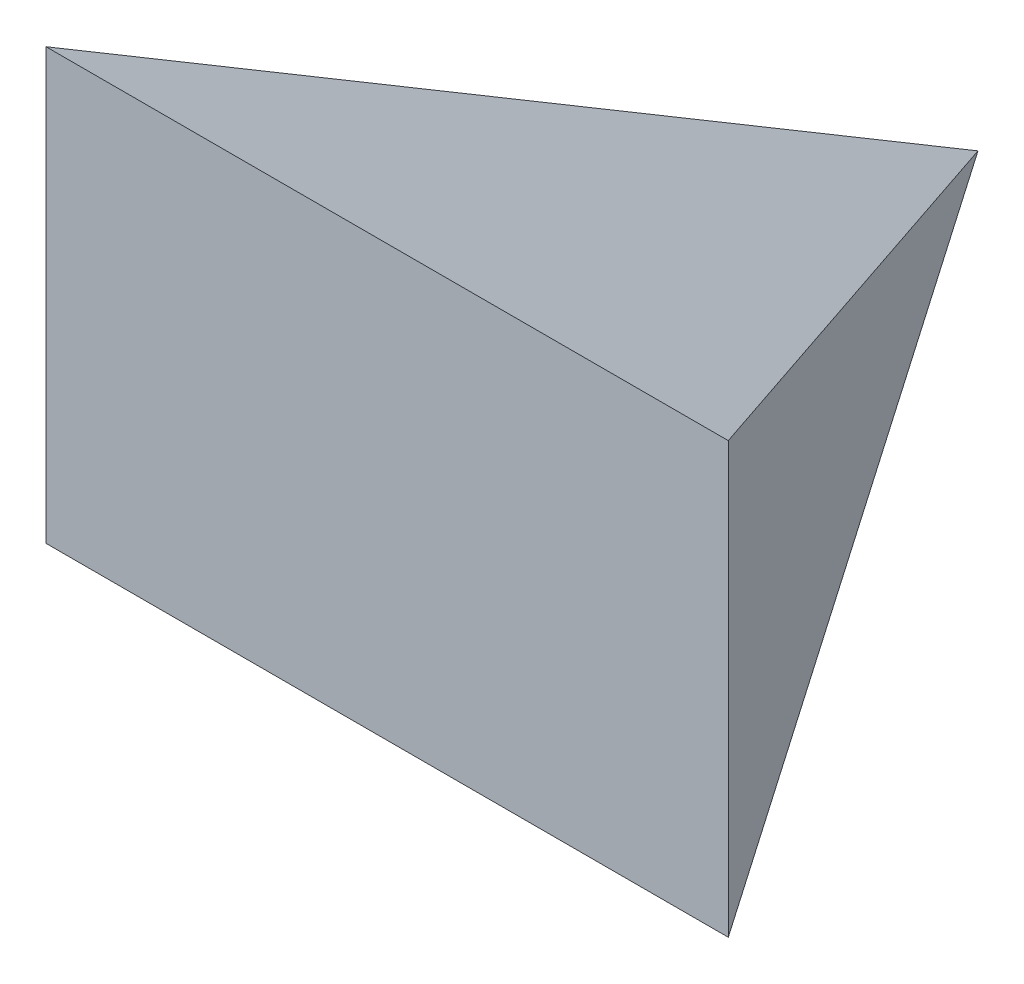
ISO-10303-21;
HEADER;
FILE_DESCRIPTION(('STEP AP214'),'2;1');
FILE_NAME('part.step','',(''),(''),'','','');
FILE_SCHEMA(('AUTOMOTIVE_DESIGN { 1 0 10303 214 1 1 1 1 }'));
ENDSEC;
DATA;
#1=APPLICATION_CONTEXT('core data for automotive mechanical design processes');
#2=APPLICATION_PROTOCOL_DEFINITION('international standard','automotive_design',2000,#1);
#3=PRODUCT_CONTEXT('',#1,'mechanical');
#4=PRODUCT('Part','Part','',(#3));
#5=PRODUCT_RELATED_PRODUCT_CATEGORY('part','',(#4));
#6=PRODUCT_DEFINITION_FORMATION('','',#4);
#7=PRODUCT_DEFINITION_CONTEXT('part definition',#1,'design');
#8=PRODUCT_DEFINITION('design','',#6,#7);
#9=PRODUCT_DEFINITION_SHAPE('','',#8);
#10=(LENGTH_UNIT() NAMED_UNIT(*) SI_UNIT(.MILLI.,.METRE.));
#11=(NAMED_UNIT(*) PLANE_ANGLE_UNIT() SI_UNIT($,.RADIAN.));
#12=(NAMED_UNIT(*) SI_UNIT($,.STERADIAN.) SOLID_ANGLE_UNIT());
#13=UNCERTAINTY_MEASURE_WITH_UNIT(LENGTH_MEASURE(1.E-05),#10,'distance_accuracy_value','');
#14=(GEOMETRIC_REPRESENTATION_CONTEXT(3) GLOBAL_UNCERTAINTY_ASSIGNED_CONTEXT((#13)) GLOBAL_UNIT_ASSIGNED_CONTEXT((#10,
#11,#12)) REPRESENTATION_CONTEXT('',''));
#15=CARTESIAN_POINT('',(0.,0.,0.));
#16=DIRECTION('',(0.,0.,1.));
#17=DIRECTION('',(1.,0.,0.));
#18=AXIS2_PLACEMENT_3D('',#15,#16,#17);
#19=CARTESIAN_POINT('',(0.,0.,660.4));
#20=DIRECTION('',(0.,0.,1.));
#21=DIRECTION('',(1.,0.,0.));
#22=AXIS2_PLACEMENT_3D('',#19,#20,#21);
#23=PLANE('',#22);
#24=DIRECTION('',(0.,-1.,0.));
#25=VECTOR('',#24,1.);
#26=CARTESIAN_POINT('',(-381.282117772826,-240.3659427094,660.4));
#27=LINE('',#26,#25);
#28=CARTESIAN_POINT('',(-381.282117772826,240.3659427094,660.4));
#29=VERTEX_POINT('',#28);
#30=CARTESIAN_POINT('',(-381.282117772826,-240.3659427094,660.4));
#31=VERTEX_POINT('',#30);
#32=EDGE_CURVE('E93',#29,#31,#27,.T.);
#33=ORIENTED_EDGE('',*,*,#32,.T.);
#34=DIRECTION('',(1.,0.,0.));
#35=VECTOR('',#34,1.);
#36=CARTESIAN_POINT('',(381.282117772826,-240.3659427094,660.4));
#37=LINE('',#36,#35);
#38=CARTESIAN_POINT('',(381.282117772826,-240.3659427094,660.4));
#39=VERTEX_POINT('',#38);
#40=EDGE_CURVE('E81',#31,#39,#37,.T.);
#41=ORIENTED_EDGE('',*,*,#40,.T.);
#42=DIRECTION('',(0.,1.,0.));
#43=VECTOR('',#42,1.);
#44=CARTESIAN_POINT('',(381.282117772826,-240.3659427094,660.4));
#45=LINE('',#44,#43);
#46=CARTESIAN_POINT('',(381.282117772826,240.3659427094,660.4));
#47=VERTEX_POINT('',#46);
#48=EDGE_CURVE('E75',#39,#47,#45,.T.);
#49=ORIENTED_EDGE('',*,*,#48,.T.);
#50=DIRECTION('',(-1.,0.,0.));
#51=VECTOR('',#50,1.);
#52=CARTESIAN_POINT('',(381.282117772826,240.3659427094,660.4));
#53=LINE('',#52,#51);
#54=EDGE_CURVE('E79',#47,#29,#53,.T.);
#55=ORIENTED_EDGE('',*,*,#54,.T.);
#56=EDGE_LOOP('',(#33,#41,#49,#55));
#57=FACE_BOUND('',#56,.T.);
#58=ADVANCED_FACE('F39',(#57),#23,.T.);
#59=CARTESIAN_POINT('',(0.,0.,0.));
#60=DIRECTION('',(0.86602540378444,0.,0.499999999999998));
#61=DIRECTION('',(0.499999999999998,0.,-0.86602540378444));
#62=AXIS2_PLACEMENT_3D('',#59,#60,#61);
#63=PLANE('',#62);
#64=DIRECTION('',(-0.476870962711471,-0.300626578483223,0.825964736070557));
#65=VECTOR('',#64,1.);
#66=CARTESIAN_POINT('',(0.,0.,0.));
#67=LINE('',#66,#65);
#68=CARTESIAN_POINT('',(0.,0.,0.));
#69=VERTEX_POINT('',#68);
#70=EDGE_CURVE('E64',#69,#31,#67,.T.);
#71=ORIENTED_EDGE('',*,*,#70,.T.);
#72=ORIENTED_EDGE('',*,*,#32,.F.);
#73=DIRECTION('',(-0.476870962711471,0.300626578483223,0.825964736070557));
#74=VECTOR('',#73,1.);
#75=CARTESIAN_POINT('',(0.,0.,0.));
#76=LINE('',#75,#74);
#77=EDGE_CURVE('E92',#69,#29,#76,.T.);
#78=ORIENTED_EDGE('',*,*,#77,.F.);
#79=EDGE_LOOP('',(#71,#72,#78));
#80=FACE_BOUND('',#79,.T.);
#81=ADVANCED_FACE('F104',(#80),#63,.F.);
#82=CARTESIAN_POINT('',(0.,0.,0.));
#83=DIRECTION('',(0.,-0.939692620785908,0.342020143325669));
#84=DIRECTION('',(0.,-0.342020143325669,-0.939692620785908));
#85=AXIS2_PLACEMENT_3D('',#82,#83,#84);
#86=PLANE('',#85);
#87=ORIENTED_EDGE('',*,*,#77,.T.);
#88=ORIENTED_EDGE('',*,*,#54,.F.);
#89=DIRECTION('',(0.476870962711471,0.300626578483223,0.825964736070557));
#90=VECTOR('',#89,1.);
#91=CARTESIAN_POINT('',(0.,0.,0.));
#92=LINE('',#91,#90);
#93=EDGE_CURVE('E12',#69,#47,#92,.T.);
#94=ORIENTED_EDGE('',*,*,#93,.F.);
#95=EDGE_LOOP('',(#87,#88,#94));
#96=FACE_BOUND('',#95,.T.);
#97=ADVANCED_FACE('F91',(#96),#86,.F.);
#98=CARTESIAN_POINT('',(0.,0.,0.));
#99=DIRECTION('',(0.,0.939692620785908,0.342020143325669));
#100=DIRECTION('',(0.,-0.342020143325669,0.939692620785908));
#101=AXIS2_PLACEMENT_3D('',#98,#99,#100);
#102=PLANE('',#101);
#103=DIRECTION('',(0.476870962711471,-0.300626578483223,0.825964736070557));
#104=VECTOR('',#103,1.);
#105=CARTESIAN_POINT('',(0.,0.,0.));
#106=LINE('',#105,#104);
#107=EDGE_CURVE('E51',#69,#39,#106,.T.);
#108=ORIENTED_EDGE('',*,*,#107,.T.);
#109=ORIENTED_EDGE('',*,*,#40,.F.);
#110=ORIENTED_EDGE('',*,*,#70,.F.);
#111=EDGE_LOOP('',(#108,#109,#110));
#112=FACE_BOUND('',#111,.T.);
#113=ADVANCED_FACE('F98',(#112),#102,.F.);
#114=CARTESIAN_POINT('',(0.,0.,0.));
#115=DIRECTION('',(-0.86602540378444,0.,0.499999999999998));
#116=DIRECTION('',(0.499999999999998,0.,0.86602540378444));
#117=AXIS2_PLACEMENT_3D('',#114,#115,#116);
#118=PLANE('',#117);
#119=ORIENTED_EDGE('',*,*,#93,.T.);
#120=ORIENTED_EDGE('',*,*,#48,.F.);
#121=ORIENTED_EDGE('',*,*,#107,.F.);
#122=EDGE_LOOP('',(#119,#120,#121));
#123=FACE_BOUND('',#122,.T.);
#124=ADVANCED_FACE('F41',(#123),#118,.F.);
#125=CLOSED_SHELL('',(#58,#81,#97,#113,#124));
#126=MANIFOLD_SOLID_BREP('B2',#125);
#127=ADVANCED_BREP_SHAPE_REPRESENTATION('',(#18,#126),#14);
#128=SHAPE_DEFINITION_REPRESENTATION(#9,#127);
ENDSEC;
END-ISO-10303-21;
